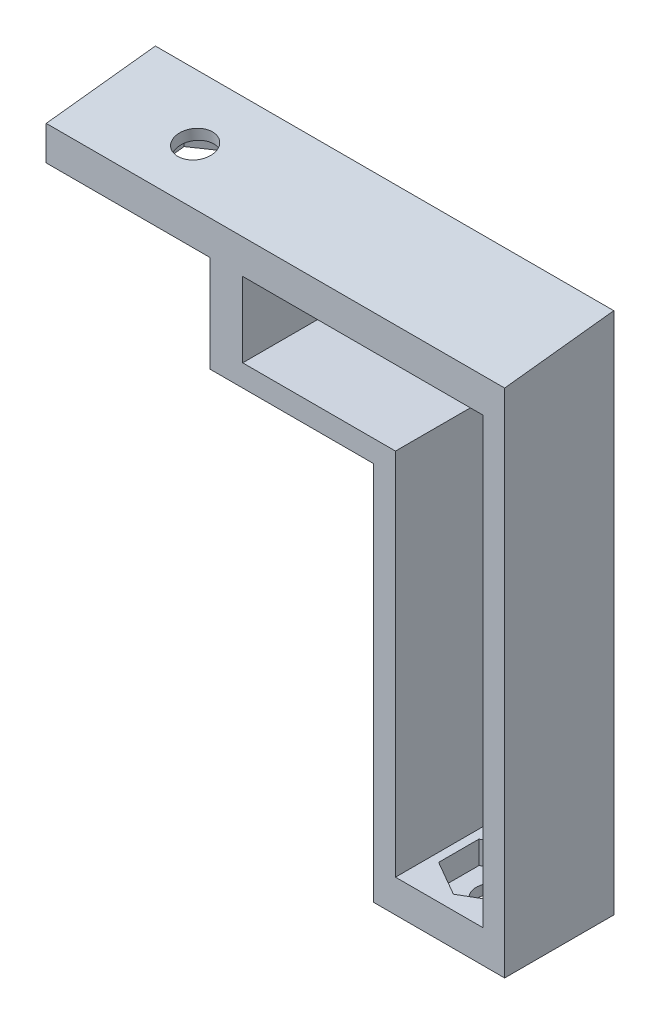
ISO-10303-21;
HEADER;
FILE_DESCRIPTION(('STEP AP214'),'2;1');
FILE_NAME('part.step','',(''),(''),'','','');
FILE_SCHEMA(('AUTOMOTIVE_DESIGN { 1 0 10303 214 1 1 1 1 }'));
ENDSEC;
DATA;
#1=APPLICATION_CONTEXT('core data for automotive mechanical design processes');
#2=APPLICATION_PROTOCOL_DEFINITION('international standard','automotive_design',2000,#1);
#3=PRODUCT_CONTEXT('',#1,'mechanical');
#4=PRODUCT('Part','Part','',(#3));
#5=PRODUCT_RELATED_PRODUCT_CATEGORY('part','',(#4));
#6=PRODUCT_DEFINITION_FORMATION('','',#4);
#7=PRODUCT_DEFINITION_CONTEXT('part definition',#1,'design');
#8=PRODUCT_DEFINITION('design','',#6,#7);
#9=PRODUCT_DEFINITION_SHAPE('','',#8);
#10=(LENGTH_UNIT() NAMED_UNIT(*) SI_UNIT(.MILLI.,.METRE.));
#11=(NAMED_UNIT(*) PLANE_ANGLE_UNIT() SI_UNIT($,.RADIAN.));
#12=(NAMED_UNIT(*) SI_UNIT($,.STERADIAN.) SOLID_ANGLE_UNIT());
#13=UNCERTAINTY_MEASURE_WITH_UNIT(LENGTH_MEASURE(1.E-05),#10,'distance_accuracy_value','');
#14=(GEOMETRIC_REPRESENTATION_CONTEXT(3) GLOBAL_UNCERTAINTY_ASSIGNED_CONTEXT((#13)) GLOBAL_UNIT_ASSIGNED_CONTEXT((#10,
#11,#12)) REPRESENTATION_CONTEXT('',''));
#15=CARTESIAN_POINT('',(0.,0.,0.));
#16=DIRECTION('',(0.,0.,1.));
#17=DIRECTION('',(1.,0.,0.));
#18=AXIS2_PLACEMENT_3D('',#15,#16,#17);
#19=CARTESIAN_POINT('',(45.,0.,-10.));
#20=DIRECTION('',(1.,0.,0.));
#21=DIRECTION('',(0.,-1.,0.));
#22=AXIS2_PLACEMENT_3D('',#19,#20,#21);
#23=PLANE('',#22);
#24=DIRECTION('',(0.,-1.,0.));
#25=VECTOR('',#24,1.);
#26=CARTESIAN_POINT('',(45.,0.,-10.));
#27=LINE('',#26,#25);
#28=CARTESIAN_POINT('',(45.,44.81,-10.));
#29=VERTEX_POINT('',#28);
#30=CARTESIAN_POINT('',(45.,34.81,-10.));
#31=VERTEX_POINT('',#30);
#32=EDGE_CURVE('E360',#29,#31,#27,.T.);
#33=ORIENTED_EDGE('',*,*,#32,.T.);
#34=DIRECTION('',(0.,0.,1.));
#35=VECTOR('',#34,1.);
#36=CARTESIAN_POINT('',(45.,34.81,-10.));
#37=LINE('',#36,#35);
#38=CARTESIAN_POINT('',(45.,34.81,0.));
#39=VERTEX_POINT('',#38);
#40=EDGE_CURVE('E11',#31,#39,#37,.T.);
#41=ORIENTED_EDGE('',*,*,#40,.T.);
#42=DIRECTION('',(0.,-1.,0.));
#43=VECTOR('',#42,1.);
#44=CARTESIAN_POINT('',(45.,0.,0.));
#45=LINE('',#44,#43);
#46=CARTESIAN_POINT('',(45.,43.6706439169836,0.));
#47=VERTEX_POINT('',#46);
#48=EDGE_CURVE('E387',#47,#39,#45,.T.);
#49=ORIENTED_EDGE('',*,*,#48,.F.);
#50=DIRECTION('',(0.,-0.1132032137679,0.993571855676588));
#51=VECTOR('',#50,1.);
#52=CARTESIAN_POINT('',(45.,44.2357613015133,-4.959971627426));
#53=LINE('',#52,#51);
#54=EDGE_CURVE('E338',#29,#47,#53,.T.);
#55=ORIENTED_EDGE('',*,*,#54,.F.);
#56=EDGE_LOOP('',(#33,#41,#49,#55));
#57=FACE_BOUND('',#56,.T.);
#58=ADVANCED_FACE('F39',(#57),#23,.F.);
#59=CARTESIAN_POINT('',(60.,34.81,-10.));
#60=DIRECTION('',(0.,-1.,0.));
#61=DIRECTION('',(-1.,0.,0.));
#62=AXIS2_PLACEMENT_3D('',#59,#60,#61);
#63=PLANE('',#62);
#64=DIRECTION('',(-1.,0.,0.));
#65=VECTOR('',#64,1.);
#66=CARTESIAN_POINT('',(60.,34.81,0.));
#67=LINE('',#66,#65);
#68=CARTESIAN_POINT('',(60.,34.81,0.));
#69=VERTEX_POINT('',#68);
#70=EDGE_CURVE('E345',#69,#39,#67,.T.);
#71=ORIENTED_EDGE('',*,*,#70,.T.);
#72=ORIENTED_EDGE('',*,*,#40,.F.);
#73=DIRECTION('',(-1.,0.,0.));
#74=VECTOR('',#73,1.);
#75=CARTESIAN_POINT('',(60.,34.81,-10.));
#76=LINE('',#75,#74);
#77=CARTESIAN_POINT('',(60.,34.81,-10.));
#78=VERTEX_POINT('',#77);
#79=EDGE_CURVE('E372',#78,#31,#76,.T.);
#80=ORIENTED_EDGE('',*,*,#79,.F.);
#81=DIRECTION('',(0.,0.,1.));
#82=VECTOR('',#81,1.);
#83=CARTESIAN_POINT('',(60.,34.81,-10.));
#84=LINE('',#83,#82);
#85=EDGE_CURVE('E48',#78,#69,#84,.T.);
#86=ORIENTED_EDGE('',*,*,#85,.T.);
#87=EDGE_LOOP('',(#71,#72,#80,#86));
#88=FACE_BOUND('',#87,.T.);
#89=ADVANCED_FACE('F458',(#88),#63,.T.);
#90=CARTESIAN_POINT('',(60.,0.,-10.));
#91=DIRECTION('',(-1.,0.,0.));
#92=DIRECTION('',(0.,0.,-1.));
#93=AXIS2_PLACEMENT_3D('',#90,#91,#92);
#94=PLANE('',#93);
#95=DIRECTION('',(0.,1.,0.));
#96=VECTOR('',#95,1.);
#97=CARTESIAN_POINT('',(60.,0.,0.));
#98=LINE('',#97,#96);
#99=CARTESIAN_POINT('',(60.,0.,0.));
#100=VERTEX_POINT('',#99);
#101=EDGE_CURVE('E399',#100,#69,#98,.T.);
#102=ORIENTED_EDGE('',*,*,#101,.T.);
#103=ORIENTED_EDGE('',*,*,#85,.F.);
#104=DIRECTION('',(0.,1.,0.));
#105=VECTOR('',#104,1.);
#106=CARTESIAN_POINT('',(60.,0.,-10.));
#107=LINE('',#106,#105);
#108=CARTESIAN_POINT('',(60.,0.,-10.));
#109=VERTEX_POINT('',#108);
#110=EDGE_CURVE('E370',#109,#78,#107,.T.);
#111=ORIENTED_EDGE('',*,*,#110,.F.);
#112=DIRECTION('',(0.,0.,1.));
#113=VECTOR('',#112,1.);
#114=CARTESIAN_POINT('',(60.,0.,-10.));
#115=LINE('',#114,#113);
#116=EDGE_CURVE('E404',#109,#100,#115,.T.);
#117=ORIENTED_EDGE('',*,*,#116,.T.);
#118=EDGE_LOOP('',(#102,#103,#111,#117));
#119=FACE_BOUND('',#118,.T.);
#120=ADVANCED_FACE('F463',(#119),#94,.T.);
#121=CARTESIAN_POINT('',(60.,0.,-10.));
#122=DIRECTION('',(0.,-1.,0.));
#123=DIRECTION('',(0.,0.,-1.));
#124=AXIS2_PLACEMENT_3D('',#121,#122,#123);
#125=PLANE('',#124);
#126=CARTESIAN_POINT('',(66.,0.,-5.));
#127=DIRECTION('',(0.,-1.,0.));
#128=DIRECTION('',(0.,0.,1.));
#129=AXIS2_PLACEMENT_3D('',#126,#127,#128);
#130=CIRCLE('',#129,1.6);
#131=CARTESIAN_POINT('',(66.,0.,-3.4));
#132=VERTEX_POINT('',#131);
#133=EDGE_CURVE('E554',#132,#132,#130,.T.);
#134=ORIENTED_EDGE('',*,*,#133,.F.);
#135=EDGE_LOOP('',(#134));
#136=FACE_BOUND('',#135,.T.);
#137=DIRECTION('',(-1.,0.,0.));
#138=VECTOR('',#137,1.);
#139=CARTESIAN_POINT('',(60.,0.,0.));
#140=LINE('',#139,#138);
#141=CARTESIAN_POINT('',(72.,0.,0.));
#142=VERTEX_POINT('',#141);
#143=EDGE_CURVE('E397',#142,#100,#140,.T.);
#144=ORIENTED_EDGE('',*,*,#143,.T.);
#145=ORIENTED_EDGE('',*,*,#116,.F.);
#146=DIRECTION('',(-1.,0.,0.));
#147=VECTOR('',#146,1.);
#148=CARTESIAN_POINT('',(60.,0.,-10.));
#149=LINE('',#148,#147);
#150=CARTESIAN_POINT('',(72.,0.,-10.));
#151=VERTEX_POINT('',#150);
#152=EDGE_CURVE('E368',#151,#109,#149,.T.);
#153=ORIENTED_EDGE('',*,*,#152,.F.);
#154=DIRECTION('',(0.,0.,1.));
#155=VECTOR('',#154,1.);
#156=CARTESIAN_POINT('',(72.,0.,-10.));
#157=LINE('',#156,#155);
#158=EDGE_CURVE('E407',#151,#142,#157,.T.);
#159=ORIENTED_EDGE('',*,*,#158,.T.);
#160=EDGE_LOOP('',(#144,#145,#153,#159));
#161=FACE_BOUND('',#160,.T.);
#162=ADVANCED_FACE('F469',(#136,#161),#125,.T.);
#163=CARTESIAN_POINT('',(72.,0.,-10.));
#164=DIRECTION('',(1.,0.,0.));
#165=DIRECTION('',(0.,-1.,0.));
#166=AXIS2_PLACEMENT_3D('',#163,#164,#165);
#167=PLANE('',#166);
#168=ORIENTED_EDGE('',*,*,#158,.F.);
#169=DIRECTION('',(0.,-1.,0.));
#170=VECTOR('',#169,1.);
#171=CARTESIAN_POINT('',(72.,0.,-10.));
#172=LINE('',#171,#170);
#173=CARTESIAN_POINT('',(72.,47.9493560830164,-10.));
#174=VERTEX_POINT('',#173);
#175=EDGE_CURVE('E366',#174,#151,#172,.T.);
#176=ORIENTED_EDGE('',*,*,#175,.F.);
#177=DIRECTION('',(0.,0.1132032137679,-0.993571855676588));
#178=VECTOR('',#177,1.);
#179=CARTESIAN_POINT('',(72.,46.2101313662985,5.26497942691786));
#180=LINE('',#179,#178);
#181=CARTESIAN_POINT('',(72.,46.81,0.));
#182=VERTEX_POINT('',#181);
#183=EDGE_CURVE('E322',#182,#174,#180,.T.);
#184=ORIENTED_EDGE('',*,*,#183,.F.);
#185=DIRECTION('',(0.,-1.,0.));
#186=VECTOR('',#185,1.);
#187=CARTESIAN_POINT('',(72.,0.,0.));
#188=LINE('',#187,#186);
#189=EDGE_CURVE('E395',#182,#142,#188,.T.);
#190=ORIENTED_EDGE('',*,*,#189,.T.);
#191=EDGE_LOOP('',(#168,#176,#184,#190));
#192=FACE_BOUND('',#191,.T.);
#193=ADVANCED_FACE('F453',(#192),#167,.T.);
#194=CARTESIAN_POINT('',(30.,0.,-10.));
#195=DIRECTION('',(-1.,0.,0.));
#196=DIRECTION('',(0.,0.,-1.));
#197=AXIS2_PLACEMENT_3D('',#194,#195,#196);
#198=PLANE('',#197);
#199=DIRECTION('',(0.,1.,0.));
#200=VECTOR('',#199,1.);
#201=CARTESIAN_POINT('',(30.,0.,0.));
#202=LINE('',#201,#200);
#203=CARTESIAN_POINT('',(30.,43.6706439169836,0.));
#204=VERTEX_POINT('',#203);
#205=CARTESIAN_POINT('',(30.,46.81,0.));
#206=VERTEX_POINT('',#205);
#207=EDGE_CURVE('E390',#204,#206,#202,.T.);
#208=ORIENTED_EDGE('',*,*,#207,.T.);
#209=DIRECTION('',(0.,0.1132032137679,-0.993571855676588));
#210=VECTOR('',#209,1.);
#211=CARTESIAN_POINT('',(30.,46.2101313662985,5.26497942691786));
#212=LINE('',#211,#210);
#213=CARTESIAN_POINT('',(30.,47.9493560830164,-10.));
#214=VERTEX_POINT('',#213);
#215=EDGE_CURVE('E319',#206,#214,#212,.T.);
#216=ORIENTED_EDGE('',*,*,#215,.T.);
#217=DIRECTION('',(0.,1.,0.));
#218=VECTOR('',#217,1.);
#219=CARTESIAN_POINT('',(30.,0.,-10.));
#220=LINE('',#219,#218);
#221=CARTESIAN_POINT('',(30.,44.81,-10.));
#222=VERTEX_POINT('',#221);
#223=EDGE_CURVE('E363',#222,#214,#220,.T.);
#224=ORIENTED_EDGE('',*,*,#223,.F.);
#225=DIRECTION('',(0.,0.1132032137679,-0.993571855676588));
#226=VECTOR('',#225,1.);
#227=CARTESIAN_POINT('',(30.,43.111006029794,4.91187869650019));
#228=LINE('',#227,#226);
#229=EDGE_CURVE('E325',#204,#222,#228,.T.);
#230=ORIENTED_EDGE('',*,*,#229,.F.);
#231=EDGE_LOOP('',(#208,#216,#224,#230));
#232=FACE_BOUND('',#231,.T.);
#233=ADVANCED_FACE('F445',(#232),#198,.T.);
#234=CARTESIAN_POINT('',(70.,0.,-10.));
#235=DIRECTION('',(1.,0.,0.));
#236=DIRECTION('',(0.,-1.,0.));
#237=AXIS2_PLACEMENT_3D('',#234,#235,#236);
#238=PLANE('',#237);
#239=DIRECTION('',(0.,-1.,0.));
#240=VECTOR('',#239,1.);
#241=CARTESIAN_POINT('',(70.,0.,-10.));
#242=LINE('',#241,#240);
#243=CARTESIAN_POINT('',(70.,44.81,-10.));
#244=VERTEX_POINT('',#243);
#245=CARTESIAN_POINT('',(70.,3.,-10.));
#246=VERTEX_POINT('',#245);
#247=EDGE_CURVE('E357',#244,#246,#242,.T.);
#248=ORIENTED_EDGE('',*,*,#247,.T.);
#249=DIRECTION('',(0.,0.,1.));
#250=VECTOR('',#249,1.);
#251=CARTESIAN_POINT('',(70.,3.,-10.));
#252=LINE('',#251,#250);
#253=CARTESIAN_POINT('',(70.,3.,0.));
#254=VERTEX_POINT('',#253);
#255=EDGE_CURVE('E410',#246,#254,#252,.T.);
#256=ORIENTED_EDGE('',*,*,#255,.T.);
#257=DIRECTION('',(0.,-1.,0.));
#258=VECTOR('',#257,1.);
#259=CARTESIAN_POINT('',(70.,0.,0.));
#260=LINE('',#259,#258);
#261=CARTESIAN_POINT('',(70.,43.6706439169836,0.));
#262=VERTEX_POINT('',#261);
#263=EDGE_CURVE('E384',#262,#254,#260,.T.);
#264=ORIENTED_EDGE('',*,*,#263,.F.);
#265=DIRECTION('',(0.,-0.1132032137679,0.993571855676588));
#266=VECTOR('',#265,1.);
#267=CARTESIAN_POINT('',(70.,44.2357613015133,-4.959971627426));
#268=LINE('',#267,#266);
#269=EDGE_CURVE('E335',#244,#262,#268,.T.);
#270=ORIENTED_EDGE('',*,*,#269,.F.);
#271=EDGE_LOOP('',(#248,#256,#264,#270));
#272=FACE_BOUND('',#271,.T.);
#273=ADVANCED_FACE('F443',(#272),#238,.F.);
#274=CARTESIAN_POINT('',(60.,3.,-10.));
#275=DIRECTION('',(0.,-1.,0.));
#276=DIRECTION('',(0.,0.,-1.));
#277=AXIS2_PLACEMENT_3D('',#274,#275,#276);
#278=PLANE('',#277);
#279=DIRECTION('',(0.,0.,-1.));
#280=VECTOR('',#279,1.);
#281=CARTESIAN_POINT('',(62.8,3.,-3.1524791385932));
#282=LINE('',#281,#280);
#283=CARTESIAN_POINT('',(62.8,3.,-3.1524791385932));
#284=VERTEX_POINT('',#283);
#285=CARTESIAN_POINT('',(62.8,3.,-6.8475208614068));
#286=VERTEX_POINT('',#285);
#287=EDGE_CURVE('E231',#284,#286,#282,.T.);
#288=ORIENTED_EDGE('',*,*,#287,.T.);
#289=DIRECTION('',(0.866025403784438,0.,-0.5));
#290=VECTOR('',#289,1.);
#291=CARTESIAN_POINT('',(62.8,3.,-6.8475208614068));
#292=LINE('',#291,#290);
#293=CARTESIAN_POINT('',(66.,3.,-8.6950417228136));
#294=VERTEX_POINT('',#293);
#295=EDGE_CURVE('E255',#286,#294,#292,.T.);
#296=ORIENTED_EDGE('',*,*,#295,.T.);
#297=DIRECTION('',(0.866025403784438,0.,0.5));
#298=VECTOR('',#297,1.);
#299=CARTESIAN_POINT('',(66.,3.,-8.6950417228136));
#300=LINE('',#299,#298);
#301=CARTESIAN_POINT('',(69.2,3.,-6.8475208614068));
#302=VERTEX_POINT('',#301);
#303=EDGE_CURVE('E258',#294,#302,#300,.T.);
#304=ORIENTED_EDGE('',*,*,#303,.T.);
#305=DIRECTION('',(0.,0.,1.));
#306=VECTOR('',#305,1.);
#307=CARTESIAN_POINT('',(69.2,3.,-6.8475208614068));
#308=LINE('',#307,#306);
#309=CARTESIAN_POINT('',(69.2,3.,-3.1524791385932));
#310=VERTEX_POINT('',#309);
#311=EDGE_CURVE('E240',#302,#310,#308,.T.);
#312=ORIENTED_EDGE('',*,*,#311,.T.);
#313=DIRECTION('',(-0.866025403784439,0.,0.5));
#314=VECTOR('',#313,1.);
#315=CARTESIAN_POINT('',(69.2,3.,-3.1524791385932));
#316=LINE('',#315,#314);
#317=CARTESIAN_POINT('',(66.,3.,-1.30495827718639));
#318=VERTEX_POINT('',#317);
#319=EDGE_CURVE('E237',#310,#318,#316,.T.);
#320=ORIENTED_EDGE('',*,*,#319,.T.);
#321=DIRECTION('',(-0.866025403784439,0.,-0.5));
#322=VECTOR('',#321,1.);
#323=CARTESIAN_POINT('',(66.,3.,-1.30495827718639));
#324=LINE('',#323,#322);
#325=EDGE_CURVE('E252',#318,#284,#324,.T.);
#326=ORIENTED_EDGE('',*,*,#325,.T.);
#327=EDGE_LOOP('',(#288,#296,#304,#312,#320,#326));
#328=FACE_BOUND('',#327,.T.);
#329=DIRECTION('',(-1.,0.,0.));
#330=VECTOR('',#329,1.);
#331=CARTESIAN_POINT('',(60.,3.,0.));
#332=LINE('',#331,#330);
#333=CARTESIAN_POINT('',(62.,3.,0.));
#334=VERTEX_POINT('',#333);
#335=EDGE_CURVE('E381',#254,#334,#332,.T.);
#336=ORIENTED_EDGE('',*,*,#335,.F.);
#337=ORIENTED_EDGE('',*,*,#255,.F.);
#338=DIRECTION('',(-1.,0.,0.));
#339=VECTOR('',#338,1.);
#340=CARTESIAN_POINT('',(60.,3.,-10.));
#341=LINE('',#340,#339);
#342=CARTESIAN_POINT('',(62.,3.,-10.));
#343=VERTEX_POINT('',#342);
#344=EDGE_CURVE('E354',#246,#343,#341,.T.);
#345=ORIENTED_EDGE('',*,*,#344,.T.);
#346=DIRECTION('',(0.,0.,1.));
#347=VECTOR('',#346,1.);
#348=CARTESIAN_POINT('',(62.,3.,-10.));
#349=LINE('',#348,#347);
#350=EDGE_CURVE('E413',#343,#334,#349,.T.);
#351=ORIENTED_EDGE('',*,*,#350,.T.);
#352=EDGE_LOOP('',(#336,#337,#345,#351));
#353=FACE_BOUND('',#352,.T.);
#354=ADVANCED_FACE('F431',(#328,#353),#278,.F.);
#355=CARTESIAN_POINT('',(62.,0.,-10.));
#356=DIRECTION('',(-1.,0.,0.));
#357=DIRECTION('',(0.,0.,-1.));
#358=AXIS2_PLACEMENT_3D('',#355,#356,#357);
#359=PLANE('',#358);
#360=DIRECTION('',(0.,1.,0.));
#361=VECTOR('',#360,1.);
#362=CARTESIAN_POINT('',(62.,0.,0.));
#363=LINE('',#362,#361);
#364=CARTESIAN_POINT('',(62.,36.81,0.));
#365=VERTEX_POINT('',#364);
#366=EDGE_CURVE('E378',#334,#365,#363,.T.);
#367=ORIENTED_EDGE('',*,*,#366,.F.);
#368=ORIENTED_EDGE('',*,*,#350,.F.);
#369=DIRECTION('',(0.,1.,0.));
#370=VECTOR('',#369,1.);
#371=CARTESIAN_POINT('',(62.,0.,-10.));
#372=LINE('',#371,#370);
#373=CARTESIAN_POINT('',(62.,36.81,-10.));
#374=VERTEX_POINT('',#373);
#375=EDGE_CURVE('E351',#343,#374,#372,.T.);
#376=ORIENTED_EDGE('',*,*,#375,.T.);
#377=DIRECTION('',(0.,0.,1.));
#378=VECTOR('',#377,1.);
#379=CARTESIAN_POINT('',(62.,36.81,-10.));
#380=LINE('',#379,#378);
#381=EDGE_CURVE('E415',#374,#365,#380,.T.);
#382=ORIENTED_EDGE('',*,*,#381,.T.);
#383=EDGE_LOOP('',(#367,#368,#376,#382));
#384=FACE_BOUND('',#383,.T.);
#385=ADVANCED_FACE('F429',(#384),#359,.F.);
#386=CARTESIAN_POINT('',(60.,36.81,-10.));
#387=DIRECTION('',(0.,-1.,0.));
#388=DIRECTION('',(0.,0.,-1.));
#389=AXIS2_PLACEMENT_3D('',#386,#387,#388);
#390=PLANE('',#389);
#391=DIRECTION('',(-1.,0.,0.));
#392=VECTOR('',#391,1.);
#393=CARTESIAN_POINT('',(60.,36.81,0.));
#394=LINE('',#393,#392);
#395=CARTESIAN_POINT('',(48.,36.81,0.));
#396=VERTEX_POINT('',#395);
#397=EDGE_CURVE('E375',#365,#396,#394,.T.);
#398=ORIENTED_EDGE('',*,*,#397,.F.);
#399=ORIENTED_EDGE('',*,*,#381,.F.);
#400=DIRECTION('',(-1.,0.,0.));
#401=VECTOR('',#400,1.);
#402=CARTESIAN_POINT('',(60.,36.81,-10.));
#403=LINE('',#402,#401);
#404=CARTESIAN_POINT('',(48.,36.81,-10.));
#405=VERTEX_POINT('',#404);
#406=EDGE_CURVE('E348',#374,#405,#403,.T.);
#407=ORIENTED_EDGE('',*,*,#406,.T.);
#408=DIRECTION('',(0.,0.,1.));
#409=VECTOR('',#408,1.);
#410=CARTESIAN_POINT('',(48.,36.81,-10.));
#411=LINE('',#410,#409);
#412=EDGE_CURVE('E43',#405,#396,#411,.T.);
#413=ORIENTED_EDGE('',*,*,#412,.T.);
#414=EDGE_LOOP('',(#398,#399,#407,#413));
#415=FACE_BOUND('',#414,.T.);
#416=ADVANCED_FACE('F422',(#415),#390,.F.);
#417=CARTESIAN_POINT('',(48.,0.,-10.));
#418=DIRECTION('',(1.,0.,0.));
#419=DIRECTION('',(0.,-1.,0.));
#420=AXIS2_PLACEMENT_3D('',#417,#418,#419);
#421=PLANE('',#420);
#422=DIRECTION('',(0.,-0.1132032137679,0.993571855676588));
#423=VECTOR('',#422,1.);
#424=CARTESIAN_POINT('',(48.,44.2357613015133,-4.959971627426));
#425=LINE('',#424,#423);
#426=CARTESIAN_POINT('',(48.,44.81,-10.));
#427=VERTEX_POINT('',#426);
#428=CARTESIAN_POINT('',(48.,43.6706439169836,0.));
#429=VERTEX_POINT('',#428);
#430=EDGE_CURVE('E332',#427,#429,#425,.T.);
#431=ORIENTED_EDGE('',*,*,#430,.T.);
#432=DIRECTION('',(0.,-1.,0.));
#433=VECTOR('',#432,1.);
#434=CARTESIAN_POINT('',(48.,0.,0.));
#435=LINE('',#434,#433);
#436=EDGE_CURVE('E341',#429,#396,#435,.T.);
#437=ORIENTED_EDGE('',*,*,#436,.T.);
#438=ORIENTED_EDGE('',*,*,#412,.F.);
#439=DIRECTION('',(0.,-1.,0.));
#440=VECTOR('',#439,1.);
#441=CARTESIAN_POINT('',(48.,0.,-10.));
#442=LINE('',#441,#440);
#443=EDGE_CURVE('E344',#427,#405,#442,.T.);
#444=ORIENTED_EDGE('',*,*,#443,.F.);
#445=EDGE_LOOP('',(#431,#437,#438,#444));
#446=FACE_BOUND('',#445,.T.);
#447=ADVANCED_FACE('F41',(#446),#421,.T.);
#448=CARTESIAN_POINT('',(60.,0.,-10.));
#449=DIRECTION('',(0.,0.,1.));
#450=DIRECTION('',(-1.,0.,0.));
#451=AXIS2_PLACEMENT_3D('',#448,#449,#450);
#452=PLANE('',#451);
#453=DIRECTION('',(1.,0.,0.));
#454=VECTOR('',#453,1.);
#455=CARTESIAN_POINT('',(60.,44.81,-10.));
#456=LINE('',#455,#454);
#457=EDGE_CURVE('E342',#427,#244,#456,.T.);
#458=ORIENTED_EDGE('',*,*,#457,.F.);
#459=ORIENTED_EDGE('',*,*,#443,.T.);
#460=ORIENTED_EDGE('',*,*,#406,.F.);
#461=ORIENTED_EDGE('',*,*,#375,.F.);
#462=ORIENTED_EDGE('',*,*,#344,.F.);
#463=ORIENTED_EDGE('',*,*,#247,.F.);
#464=EDGE_LOOP('',(#458,#459,#460,#461,#462,#463));
#465=FACE_BOUND('',#464,.T.);
#466=ORIENTED_EDGE('',*,*,#152,.T.);
#467=ORIENTED_EDGE('',*,*,#110,.T.);
#468=ORIENTED_EDGE('',*,*,#79,.T.);
#469=ORIENTED_EDGE('',*,*,#32,.F.);
#470=EDGE_CURVE('E346',#222,#29,#456,.T.);
#471=ORIENTED_EDGE('',*,*,#470,.F.);
#472=ORIENTED_EDGE('',*,*,#223,.T.);
#473=DIRECTION('',(-1.,0.,0.));
#474=VECTOR('',#473,1.);
#475=CARTESIAN_POINT('',(82.0646973269893,47.9493560830164,-10.));
#476=LINE('',#475,#474);
#477=EDGE_CURVE('E309',#174,#214,#476,.T.);
#478=ORIENTED_EDGE('',*,*,#477,.F.);
#479=ORIENTED_EDGE('',*,*,#175,.T.);
#480=EDGE_LOOP('',(#466,#467,#468,#469,#471,#472,#478,#479));
#481=FACE_BOUND('',#480,.T.);
#482=ADVANCED_FACE('F435',(#465,#481),#452,.F.);
#483=CARTESIAN_POINT('',(60.,0.,0.));
#484=DIRECTION('',(0.,0.,1.));
#485=DIRECTION('',(-1.,0.,0.));
#486=AXIS2_PLACEMENT_3D('',#483,#484,#485);
#487=PLANE('',#486);
#488=ORIENTED_EDGE('',*,*,#48,.T.);
#489=ORIENTED_EDGE('',*,*,#70,.F.);
#490=ORIENTED_EDGE('',*,*,#101,.F.);
#491=ORIENTED_EDGE('',*,*,#143,.F.);
#492=ORIENTED_EDGE('',*,*,#189,.F.);
#493=DIRECTION('',(1.,0.,0.));
#494=VECTOR('',#493,1.);
#495=CARTESIAN_POINT('',(60.,46.81,0.));
#496=LINE('',#495,#494);
#497=EDGE_CURVE('E393',#206,#182,#496,.T.);
#498=ORIENTED_EDGE('',*,*,#497,.F.);
#499=ORIENTED_EDGE('',*,*,#207,.F.);
#500=DIRECTION('',(-1.,0.,0.));
#501=VECTOR('',#500,1.);
#502=CARTESIAN_POINT('',(82.0646973269893,43.6706439169836,0.));
#503=LINE('',#502,#501);
#504=EDGE_CURVE('E329',#47,#204,#503,.T.);
#505=ORIENTED_EDGE('',*,*,#504,.F.);
#506=EDGE_LOOP('',(#488,#489,#490,#491,#492,#498,#499,#505));
#507=FACE_BOUND('',#506,.T.);
#508=ORIENTED_EDGE('',*,*,#263,.T.);
#509=ORIENTED_EDGE('',*,*,#335,.T.);
#510=ORIENTED_EDGE('',*,*,#366,.T.);
#511=ORIENTED_EDGE('',*,*,#397,.T.);
#512=ORIENTED_EDGE('',*,*,#436,.F.);
#513=EDGE_CURVE('E331',#262,#429,#503,.T.);
#514=ORIENTED_EDGE('',*,*,#513,.F.);
#515=EDGE_LOOP('',(#508,#509,#510,#511,#512,#514));
#516=FACE_BOUND('',#515,.T.);
#517=ADVANCED_FACE('F427',(#507,#516),#487,.T.);
#518=CARTESIAN_POINT('',(82.0646973269893,43.111006029794,4.91187869650019));
#519=DIRECTION('',(0.,-0.993571855676588,-0.1132032137679));
#520=DIRECTION('',(0.,0.1132032137679,-0.993571855676588));
#521=AXIS2_PLACEMENT_3D('',#518,#519,#520);
#522=PLANE('',#521);
#523=DIRECTION('',(0.,-0.113203213767901,0.993571855676588));
#524=VECTOR('',#523,1.);
#525=CARTESIAN_POINT('',(35.8,44.4494672575063,-6.83564473066917));
#526=LINE('',#525,#524);
#527=CARTESIAN_POINT('',(35.8,44.4494672575063,-6.83564473066917));
#528=VERTEX_POINT('',#527);
#529=CARTESIAN_POINT('',(35.8,44.0311766594773,-3.16435526933084));
#530=VERTEX_POINT('',#529);
#531=EDGE_CURVE('E277',#528,#530,#526,.T.);
#532=ORIENTED_EDGE('',*,*,#531,.T.);
#533=DIRECTION('',(0.866025403784438,-0.0566016068839497,0.496785927838294));
#534=VECTOR('',#533,1.);
#535=CARTESIAN_POINT('',(35.8,44.0311766594773,-3.16435526933083));
#536=LINE('',#535,#534);
#537=CARTESIAN_POINT('',(39.,43.8220313604629,-1.32871053866167));
#538=VERTEX_POINT('',#537);
#539=EDGE_CURVE('E293',#530,#538,#536,.T.);
#540=ORIENTED_EDGE('',*,*,#539,.T.);
#541=DIRECTION('',(0.866025403784439,0.0566016068839496,-0.496785927838294));
#542=VECTOR('',#541,1.);
#543=CARTESIAN_POINT('',(39.,43.8220313604629,-1.32871053866167));
#544=LINE('',#543,#542);
#545=CARTESIAN_POINT('',(42.2,44.0311766594773,-3.16435526933083));
#546=VERTEX_POINT('',#545);
#547=EDGE_CURVE('E296',#538,#546,#544,.T.);
#548=ORIENTED_EDGE('',*,*,#547,.T.);
#549=DIRECTION('',(0.,0.113203213767901,-0.993571855676588));
#550=VECTOR('',#549,1.);
#551=CARTESIAN_POINT('',(42.2,44.0311766594773,-3.16435526933083));
#552=LINE('',#551,#550);
#553=CARTESIAN_POINT('',(42.2,44.4494672575063,-6.83564473066917));
#554=VERTEX_POINT('',#553);
#555=EDGE_CURVE('E299',#546,#554,#552,.T.);
#556=ORIENTED_EDGE('',*,*,#555,.T.);
#557=DIRECTION('',(-0.866025403784439,0.0566016068839495,-0.496785927838294));
#558=VECTOR('',#557,1.);
#559=CARTESIAN_POINT('',(42.2,44.4494672575063,-6.83564473066917));
#560=LINE('',#559,#558);
#561=CARTESIAN_POINT('',(39.,44.6586125565208,-8.67128946133834));
#562=VERTEX_POINT('',#561);
#563=EDGE_CURVE('E302',#554,#562,#560,.T.);
#564=ORIENTED_EDGE('',*,*,#563,.T.);
#565=DIRECTION('',(-0.866025403784439,-0.0566016068839497,0.496785927838294));
#566=VECTOR('',#565,1.);
#567=CARTESIAN_POINT('',(39.,44.6586125565208,-8.67128946133834));
#568=LINE('',#567,#566);
#569=EDGE_CURVE('E281',#562,#528,#568,.T.);
#570=ORIENTED_EDGE('',*,*,#569,.T.);
#571=EDGE_LOOP('',(#532,#540,#548,#556,#564,#570));
#572=FACE_BOUND('',#571,.T.);
#573=ORIENTED_EDGE('',*,*,#54,.T.);
#574=ORIENTED_EDGE('',*,*,#504,.T.);
#575=ORIENTED_EDGE('',*,*,#229,.T.);
#576=ORIENTED_EDGE('',*,*,#470,.T.);
#577=EDGE_LOOP('',(#573,#574,#575,#576));
#578=FACE_BOUND('',#577,.T.);
#579=ADVANCED_FACE('F479',(#572,#578),#522,.T.);
#580=ORIENTED_EDGE('',*,*,#269,.T.);
#581=ORIENTED_EDGE('',*,*,#513,.T.);
#582=ORIENTED_EDGE('',*,*,#430,.F.);
#583=ORIENTED_EDGE('',*,*,#457,.T.);
#584=EDGE_LOOP('',(#580,#581,#582,#583));
#585=FACE_BOUND('',#584,.T.);
#586=ADVANCED_FACE('F439',(#585),#522,.T.);
#587=CARTESIAN_POINT('',(82.0646973269893,46.2101313662985,5.26497942691786));
#588=DIRECTION('',(0.,-0.993571855676588,-0.1132032137679));
#589=DIRECTION('',(0.,0.1132032137679,-0.993571855676588));
#590=AXIS2_PLACEMENT_3D('',#587,#588,#589);
#591=PLANE('',#590);
#592=CARTESIAN_POINT('',(39.,47.3394472949963,-4.64689926958234));
#593=DIRECTION('',(0.,0.993571855676588,0.1132032137679));
#594=DIRECTION('',(0.,0.1132032137679,-0.993571855676588));
#595=AXIS2_PLACEMENT_3D('',#592,#593,#594);
#596=CIRCLE('',#595,1.6);
#597=CARTESIAN_POINT('',(39.,47.520572437025,-6.23661423866488));
#598=VERTEX_POINT('',#597);
#599=EDGE_CURVE('E274',#598,#598,#596,.T.);
#600=ORIENTED_EDGE('',*,*,#599,.F.);
#601=EDGE_LOOP('',(#600));
#602=FACE_BOUND('',#601,.T.);
#603=ORIENTED_EDGE('',*,*,#183,.T.);
#604=ORIENTED_EDGE('',*,*,#477,.T.);
#605=ORIENTED_EDGE('',*,*,#215,.F.);
#606=ORIENTED_EDGE('',*,*,#497,.T.);
#607=EDGE_LOOP('',(#603,#604,#605,#606));
#608=FACE_BOUND('',#607,.T.);
#609=ADVANCED_FACE('F486',(#602,#608),#591,.F.);
#610=CARTESIAN_POINT('',(35.8,46.5359681544272,-6.59791798175658));
#611=DIRECTION('',(-1.,0.,0.));
#612=DIRECTION('',(0.,1.,0.));
#613=AXIS2_PLACEMENT_3D('',#610,#611,#612);
#614=PLANE('',#613);
#615=ORIENTED_EDGE('',*,*,#531,.F.);
#616=DIRECTION('',(0.,-0.993571855676588,-0.1132032137679));
#617=VECTOR('',#616,1.);
#618=CARTESIAN_POINT('',(35.8,46.5359681544272,-6.59791798175658));
#619=LINE('',#618,#617);
#620=CARTESIAN_POINT('',(35.8,46.5359681544272,-6.59791798175658));
#621=VERTEX_POINT('',#620);
#622=EDGE_CURVE('E307',#621,#528,#619,.T.);
#623=ORIENTED_EDGE('',*,*,#622,.F.);
#624=DIRECTION('',(0.,-0.113203213767901,0.993571855676588));
#625=VECTOR('',#624,1.);
#626=CARTESIAN_POINT('',(35.8,46.5359681544272,-6.59791798175658));
#627=LINE('',#626,#625);
#628=CARTESIAN_POINT('',(35.8,46.1176775563982,-2.92662852041824));
#629=VERTEX_POINT('',#628);
#630=EDGE_CURVE('E278',#621,#629,#627,.T.);
#631=ORIENTED_EDGE('',*,*,#630,.T.);
#632=DIRECTION('',(0.,-0.993571855676588,-0.1132032137679));
#633=VECTOR('',#632,1.);
#634=CARTESIAN_POINT('',(35.8,46.1176775563982,-2.92662852041824));
#635=LINE('',#634,#633);
#636=EDGE_CURVE('E64',#629,#530,#635,.T.);
#637=ORIENTED_EDGE('',*,*,#636,.T.);
#638=EDGE_LOOP('',(#615,#623,#631,#637));
#639=FACE_BOUND('',#638,.T.);
#640=ADVANCED_FACE('F489',(#639),#614,.F.);
#641=CARTESIAN_POINT('',(39.,46.7451134534416,-8.43356271242575));
#642=DIRECTION('',(-0.5,0.0980368589130417,-0.860458467501171));
#643=DIRECTION('',(0.864623545564125,0.,-0.502420266764908));
#644=AXIS2_PLACEMENT_3D('',#641,#642,#643);
#645=PLANE('',#644);
#646=ORIENTED_EDGE('',*,*,#569,.F.);
#647=DIRECTION('',(0.,-0.993571855676588,-0.1132032137679));
#648=VECTOR('',#647,1.);
#649=CARTESIAN_POINT('',(39.,46.7451134534416,-8.43356271242575));
#650=LINE('',#649,#648);
#651=CARTESIAN_POINT('',(39.,46.7451134534416,-8.43356271242575));
#652=VERTEX_POINT('',#651);
#653=EDGE_CURVE('E310',#652,#562,#650,.T.);
#654=ORIENTED_EDGE('',*,*,#653,.F.);
#655=DIRECTION('',(-0.866025403784439,-0.0566016068839497,0.496785927838294));
#656=VECTOR('',#655,1.);
#657=CARTESIAN_POINT('',(39.,46.7451134534416,-8.43356271242575));
#658=LINE('',#657,#656);
#659=EDGE_CURVE('E289',#652,#621,#658,.T.);
#660=ORIENTED_EDGE('',*,*,#659,.T.);
#661=ORIENTED_EDGE('',*,*,#622,.T.);
#662=EDGE_LOOP('',(#646,#654,#660,#661));
#663=FACE_BOUND('',#662,.T.);
#664=ADVANCED_FACE('F493',(#663),#645,.F.);
#665=CARTESIAN_POINT('',(42.2,46.5359681544272,-6.59791798175658));
#666=DIRECTION('',(0.5,0.0980368589130418,-0.860458467501171));
#667=DIRECTION('',(0.864623545564125,0.,0.502420266764908));
#668=AXIS2_PLACEMENT_3D('',#665,#666,#667);
#669=PLANE('',#668);
#670=ORIENTED_EDGE('',*,*,#563,.F.);
#671=DIRECTION('',(0.,-0.993571855676588,-0.1132032137679));
#672=VECTOR('',#671,1.);
#673=CARTESIAN_POINT('',(42.2,46.5359681544272,-6.59791798175658));
#674=LINE('',#673,#672);
#675=CARTESIAN_POINT('',(42.2,46.5359681544272,-6.59791798175658));
#676=VERTEX_POINT('',#675);
#677=EDGE_CURVE('E312',#676,#554,#674,.T.);
#678=ORIENTED_EDGE('',*,*,#677,.F.);
#679=DIRECTION('',(-0.866025403784439,0.0566016068839495,-0.496785927838294));
#680=VECTOR('',#679,1.);
#681=CARTESIAN_POINT('',(42.2,46.5359681544272,-6.59791798175658));
#682=LINE('',#681,#680);
#683=EDGE_CURVE('E287',#676,#652,#682,.T.);
#684=ORIENTED_EDGE('',*,*,#683,.T.);
#685=ORIENTED_EDGE('',*,*,#653,.T.);
#686=EDGE_LOOP('',(#670,#678,#684,#685));
#687=FACE_BOUND('',#686,.T.);
#688=ADVANCED_FACE('F506',(#687),#669,.F.);
#689=CARTESIAN_POINT('',(42.2,46.1176775563982,-2.92662852041824));
#690=DIRECTION('',(1.,0.,0.));
#691=DIRECTION('',(0.,-1.,0.));
#692=AXIS2_PLACEMENT_3D('',#689,#690,#691);
#693=PLANE('',#692);
#694=ORIENTED_EDGE('',*,*,#555,.F.);
#695=DIRECTION('',(0.,-0.993571855676588,-0.1132032137679));
#696=VECTOR('',#695,1.);
#697=CARTESIAN_POINT('',(42.2,46.1176775563982,-2.92662852041824));
#698=LINE('',#697,#696);
#699=CARTESIAN_POINT('',(42.2,46.1176775563982,-2.92662852041824));
#700=VERTEX_POINT('',#699);
#701=EDGE_CURVE('E314',#700,#546,#698,.T.);
#702=ORIENTED_EDGE('',*,*,#701,.F.);
#703=DIRECTION('',(0.,0.113203213767901,-0.993571855676588));
#704=VECTOR('',#703,1.);
#705=CARTESIAN_POINT('',(42.2,46.1176775563982,-2.92662852041824));
#706=LINE('',#705,#704);
#707=EDGE_CURVE('E285',#700,#676,#706,.T.);
#708=ORIENTED_EDGE('',*,*,#707,.T.);
#709=ORIENTED_EDGE('',*,*,#677,.T.);
#710=EDGE_LOOP('',(#694,#702,#708,#709));
#711=FACE_BOUND('',#710,.T.);
#712=ADVANCED_FACE('F502',(#711),#693,.F.);
#713=CARTESIAN_POINT('',(39.,45.9085322573837,-1.09098378974908));
#714=DIRECTION('',(0.5,-0.0980368589130417,0.860458467501172));
#715=DIRECTION('',(-0.864623545564125,0.,0.502420266764907));
#716=AXIS2_PLACEMENT_3D('',#713,#714,#715);
#717=PLANE('',#716);
#718=ORIENTED_EDGE('',*,*,#547,.F.);
#719=DIRECTION('',(0.,-0.993571855676588,-0.1132032137679));
#720=VECTOR('',#719,1.);
#721=CARTESIAN_POINT('',(39.,45.9085322573837,-1.09098378974908));
#722=LINE('',#721,#720);
#723=CARTESIAN_POINT('',(39.,45.9085322573837,-1.09098378974908));
#724=VERTEX_POINT('',#723);
#725=EDGE_CURVE('E316',#724,#538,#722,.T.);
#726=ORIENTED_EDGE('',*,*,#725,.F.);
#727=DIRECTION('',(0.866025403784439,0.0566016068839496,-0.496785927838294));
#728=VECTOR('',#727,1.);
#729=CARTESIAN_POINT('',(39.,45.9085322573837,-1.09098378974908));
#730=LINE('',#729,#728);
#731=EDGE_CURVE('E283',#724,#700,#730,.T.);
#732=ORIENTED_EDGE('',*,*,#731,.T.);
#733=ORIENTED_EDGE('',*,*,#701,.T.);
#734=EDGE_LOOP('',(#718,#726,#732,#733));
#735=FACE_BOUND('',#734,.T.);
#736=ADVANCED_FACE('F498',(#735),#717,.F.);
#737=CARTESIAN_POINT('',(35.8,46.1176775563982,-2.92662852041824));
#738=DIRECTION('',(-0.5,-0.0980368589130418,0.860458467501171));
#739=DIRECTION('',(-0.864623545564125,0.,-0.502420266764908));
#740=AXIS2_PLACEMENT_3D('',#737,#738,#739);
#741=PLANE('',#740);
#742=ORIENTED_EDGE('',*,*,#539,.F.);
#743=ORIENTED_EDGE('',*,*,#636,.F.);
#744=DIRECTION('',(0.866025403784438,-0.0566016068839497,0.496785927838294));
#745=VECTOR('',#744,1.);
#746=CARTESIAN_POINT('',(35.8,46.1176775563982,-2.92662852041824));
#747=LINE('',#746,#745);
#748=EDGE_CURVE('E280',#629,#724,#747,.T.);
#749=ORIENTED_EDGE('',*,*,#748,.T.);
#750=ORIENTED_EDGE('',*,*,#725,.T.);
#751=EDGE_LOOP('',(#742,#743,#749,#750));
#752=FACE_BOUND('',#751,.T.);
#753=ADVANCED_FACE('F494',(#752),#741,.F.);
#754=CARTESIAN_POINT('',(60.,45.1975069267149,5.14960544541282));
#755=DIRECTION('',(0.,-0.993571855676588,-0.113203213767901));
#756=DIRECTION('',(0.,0.113203213767901,-0.993571855676588));
#757=AXIS2_PLACEMENT_3D('',#754,#755,#756);
#758=PLANE('',#757);
#759=CARTESIAN_POINT('',(39.,46.3268228554127,-4.76227325108741));
#760=DIRECTION('',(0.,0.993571855676588,0.113203213767901));
#761=DIRECTION('',(0.,0.113203213767901,-0.993571855676588));
#762=AXIS2_PLACEMENT_3D('',#759,#760,#761);
#763=CIRCLE('',#762,1.6);
#764=CARTESIAN_POINT('',(39.,46.5079479974413,-6.35198822016995));
#765=VERTEX_POINT('',#764);
#766=EDGE_CURVE('E264',#765,#765,#763,.T.);
#767=ORIENTED_EDGE('',*,*,#766,.T.);
#768=EDGE_LOOP('',(#767));
#769=FACE_BOUND('',#768,.T.);
#770=ORIENTED_EDGE('',*,*,#630,.F.);
#771=ORIENTED_EDGE('',*,*,#659,.F.);
#772=ORIENTED_EDGE('',*,*,#683,.F.);
#773=ORIENTED_EDGE('',*,*,#707,.F.);
#774=ORIENTED_EDGE('',*,*,#731,.F.);
#775=ORIENTED_EDGE('',*,*,#748,.F.);
#776=EDGE_LOOP('',(#770,#771,#772,#773,#774,#775));
#777=FACE_BOUND('',#776,.T.);
#778=ADVANCED_FACE('F497',(#769,#777),#758,.T.);
#779=CARTESIAN_POINT('',(39.,48.4642025667156,-4.51874959350853));
#780=DIRECTION('',(0.,-0.993571855676588,-0.1132032137679));
#781=DIRECTION('',(0.,0.1132032137679,-0.993571855676588));
#782=AXIS2_PLACEMENT_3D('',#779,#780,#781);
#783=CYLINDRICAL_SURFACE('',#782,1.6);
#784=ORIENTED_EDGE('',*,*,#766,.F.);
#785=EDGE_LOOP('',(#784));
#786=FACE_BOUND('',#785,.T.);
#787=ORIENTED_EDGE('',*,*,#599,.T.);
#788=EDGE_LOOP('',(#787));
#789=FACE_BOUND('',#788,.T.);
#790=ADVANCED_FACE('F516',(#786,#789),#783,.F.);
#791=CARTESIAN_POINT('',(66.,0.9,-1.30495827718639));
#792=DIRECTION('',(-0.5,0.,0.866025403784439));
#793=DIRECTION('',(-0.866025403784439,0.,-0.5));
#794=AXIS2_PLACEMENT_3D('',#791,#792,#793);
#795=PLANE('',#794);
#796=ORIENTED_EDGE('',*,*,#325,.F.);
#797=DIRECTION('',(0.,1.,0.));
#798=VECTOR('',#797,1.);
#799=CARTESIAN_POINT('',(66.,0.9,-1.30495827718639));
#800=LINE('',#799,#798);
#801=CARTESIAN_POINT('',(66.,0.9,-1.30495827718639));
#802=VERTEX_POINT('',#801);
#803=EDGE_CURVE('E236',#802,#318,#800,.T.);
#804=ORIENTED_EDGE('',*,*,#803,.F.);
#805=DIRECTION('',(-0.866025403784439,0.,-0.5));
#806=VECTOR('',#805,1.);
#807=CARTESIAN_POINT('',(66.,0.9,-1.30495827718639));
#808=LINE('',#807,#806);
#809=CARTESIAN_POINT('',(62.8,0.9,-3.1524791385932));
#810=VERTEX_POINT('',#809);
#811=EDGE_CURVE('E221',#802,#810,#808,.T.);
#812=ORIENTED_EDGE('',*,*,#811,.T.);
#813=DIRECTION('',(0.,1.,0.));
#814=VECTOR('',#813,1.);
#815=CARTESIAN_POINT('',(62.8,0.9,-3.1524791385932));
#816=LINE('',#815,#814);
#817=EDGE_CURVE('E56',#810,#284,#816,.T.);
#818=ORIENTED_EDGE('',*,*,#817,.T.);
#819=EDGE_LOOP('',(#796,#804,#812,#818));
#820=FACE_BOUND('',#819,.T.);
#821=ADVANCED_FACE('F235',(#820),#795,.F.);
#822=CARTESIAN_POINT('',(69.2,0.9,-3.1524791385932));
#823=DIRECTION('',(0.5,0.,0.866025403784439));
#824=DIRECTION('',(-0.866025403784439,0.,0.5));
#825=AXIS2_PLACEMENT_3D('',#822,#823,#824);
#826=PLANE('',#825);
#827=ORIENTED_EDGE('',*,*,#319,.F.);
#828=DIRECTION('',(0.,1.,0.));
#829=VECTOR('',#828,1.);
#830=CARTESIAN_POINT('',(69.2,0.9,-3.1524791385932));
#831=LINE('',#830,#829);
#832=CARTESIAN_POINT('',(69.2,0.9,-3.1524791385932));
#833=VERTEX_POINT('',#832);
#834=EDGE_CURVE('E265',#833,#310,#831,.T.);
#835=ORIENTED_EDGE('',*,*,#834,.F.);
#836=DIRECTION('',(-0.866025403784439,0.,0.5));
#837=VECTOR('',#836,1.);
#838=CARTESIAN_POINT('',(69.2,0.9,-3.1524791385932));
#839=LINE('',#838,#837);
#840=EDGE_CURVE('E233',#833,#802,#839,.T.);
#841=ORIENTED_EDGE('',*,*,#840,.T.);
#842=ORIENTED_EDGE('',*,*,#803,.T.);
#843=EDGE_LOOP('',(#827,#835,#841,#842));
#844=FACE_BOUND('',#843,.T.);
#845=ADVANCED_FACE('F523',(#844),#826,.F.);
#846=CARTESIAN_POINT('',(69.2,0.9,-6.8475208614068));
#847=DIRECTION('',(1.,0.,0.));
#848=DIRECTION('',(0.,0.,1.));
#849=AXIS2_PLACEMENT_3D('',#846,#847,#848);
#850=PLANE('',#849);
#851=ORIENTED_EDGE('',*,*,#311,.F.);
#852=DIRECTION('',(0.,1.,0.));
#853=VECTOR('',#852,1.);
#854=CARTESIAN_POINT('',(69.2,0.9,-6.8475208614068));
#855=LINE('',#854,#853);
#856=CARTESIAN_POINT('',(69.2,0.9,-6.8475208614068));
#857=VERTEX_POINT('',#856);
#858=EDGE_CURVE('E267',#857,#302,#855,.T.);
#859=ORIENTED_EDGE('',*,*,#858,.F.);
#860=DIRECTION('',(0.,0.,1.));
#861=VECTOR('',#860,1.);
#862=CARTESIAN_POINT('',(69.2,0.9,-6.8475208614068));
#863=LINE('',#862,#861);
#864=EDGE_CURVE('E249',#857,#833,#863,.T.);
#865=ORIENTED_EDGE('',*,*,#864,.T.);
#866=ORIENTED_EDGE('',*,*,#834,.T.);
#867=EDGE_LOOP('',(#851,#859,#865,#866));
#868=FACE_BOUND('',#867,.T.);
#869=ADVANCED_FACE('F533',(#868),#850,.F.);
#870=CARTESIAN_POINT('',(66.,0.9,-8.6950417228136));
#871=DIRECTION('',(0.5,0.,-0.866025403784438));
#872=DIRECTION('',(0.866025403784439,0.,0.5));
#873=AXIS2_PLACEMENT_3D('',#870,#871,#872);
#874=PLANE('',#873);
#875=ORIENTED_EDGE('',*,*,#303,.F.);
#876=DIRECTION('',(0.,1.,0.));
#877=VECTOR('',#876,1.);
#878=CARTESIAN_POINT('',(66.,0.9,-8.6950417228136));
#879=LINE('',#878,#877);
#880=CARTESIAN_POINT('',(66.,0.9,-8.6950417228136));
#881=VERTEX_POINT('',#880);
#882=EDGE_CURVE('E269',#881,#294,#879,.T.);
#883=ORIENTED_EDGE('',*,*,#882,.F.);
#884=DIRECTION('',(0.866025403784438,0.,0.5));
#885=VECTOR('',#884,1.);
#886=CARTESIAN_POINT('',(66.,0.9,-8.6950417228136));
#887=LINE('',#886,#885);
#888=EDGE_CURVE('E247',#881,#857,#887,.T.);
#889=ORIENTED_EDGE('',*,*,#888,.T.);
#890=ORIENTED_EDGE('',*,*,#858,.T.);
#891=EDGE_LOOP('',(#875,#883,#889,#890));
#892=FACE_BOUND('',#891,.T.);
#893=ADVANCED_FACE('F529',(#892),#874,.F.);
#894=CARTESIAN_POINT('',(62.8,0.9,-6.8475208614068));
#895=DIRECTION('',(-0.5,0.,-0.866025403784438));
#896=DIRECTION('',(0.866025403784439,0.,-0.5));
#897=AXIS2_PLACEMENT_3D('',#894,#895,#896);
#898=PLANE('',#897);
#899=ORIENTED_EDGE('',*,*,#295,.F.);
#900=DIRECTION('',(0.,1.,0.));
#901=VECTOR('',#900,1.);
#902=CARTESIAN_POINT('',(62.8,0.9,-6.8475208614068));
#903=LINE('',#902,#901);
#904=CARTESIAN_POINT('',(62.8,0.9,-6.8475208614068));
#905=VERTEX_POINT('',#904);
#906=EDGE_CURVE('E232',#905,#286,#903,.T.);
#907=ORIENTED_EDGE('',*,*,#906,.F.);
#908=DIRECTION('',(0.866025403784438,0.,-0.5));
#909=VECTOR('',#908,1.);
#910=CARTESIAN_POINT('',(62.8,0.9,-6.8475208614068));
#911=LINE('',#910,#909);
#912=EDGE_CURVE('E224',#905,#881,#911,.T.);
#913=ORIENTED_EDGE('',*,*,#912,.T.);
#914=ORIENTED_EDGE('',*,*,#882,.T.);
#915=EDGE_LOOP('',(#899,#907,#913,#914));
#916=FACE_BOUND('',#915,.T.);
#917=ADVANCED_FACE('F526',(#916),#898,.F.);
#918=CARTESIAN_POINT('',(62.8,0.9,-3.1524791385932));
#919=DIRECTION('',(-1.,0.,0.));
#920=DIRECTION('',(0.,0.,-1.));
#921=AXIS2_PLACEMENT_3D('',#918,#919,#920);
#922=PLANE('',#921);
#923=ORIENTED_EDGE('',*,*,#287,.F.);
#924=ORIENTED_EDGE('',*,*,#817,.F.);
#925=DIRECTION('',(0.,0.,-1.));
#926=VECTOR('',#925,1.);
#927=CARTESIAN_POINT('',(62.8,0.9,-3.1524791385932));
#928=LINE('',#927,#926);
#929=EDGE_CURVE('E218',#810,#905,#928,.T.);
#930=ORIENTED_EDGE('',*,*,#929,.T.);
#931=ORIENTED_EDGE('',*,*,#906,.T.);
#932=EDGE_LOOP('',(#923,#924,#930,#931));
#933=FACE_BOUND('',#932,.T.);
#934=ADVANCED_FACE('F229',(#933),#922,.F.);
#935=CARTESIAN_POINT('',(60.,0.9,0.));
#936=DIRECTION('',(0.,1.,0.));
#937=DIRECTION('',(0.,0.,1.));
#938=AXIS2_PLACEMENT_3D('',#935,#936,#937);
#939=PLANE('',#938);
#940=CARTESIAN_POINT('',(66.,0.9,-5.));
#941=DIRECTION('',(0.,-1.,0.));
#942=DIRECTION('',(0.,0.,1.));
#943=AXIS2_PLACEMENT_3D('',#940,#941,#942);
#944=CIRCLE('',#943,1.6);
#945=CARTESIAN_POINT('',(66.,0.9,-3.4));
#946=VERTEX_POINT('',#945);
#947=EDGE_CURVE('E243',#946,#946,#944,.T.);
#948=ORIENTED_EDGE('',*,*,#947,.T.);
#949=EDGE_LOOP('',(#948));
#950=FACE_BOUND('',#949,.T.);
#951=ORIENTED_EDGE('',*,*,#811,.F.);
#952=ORIENTED_EDGE('',*,*,#840,.F.);
#953=ORIENTED_EDGE('',*,*,#864,.F.);
#954=ORIENTED_EDGE('',*,*,#888,.F.);
#955=ORIENTED_EDGE('',*,*,#912,.F.);
#956=ORIENTED_EDGE('',*,*,#929,.F.);
#957=EDGE_LOOP('',(#951,#952,#953,#954,#955,#956));
#958=FACE_BOUND('',#957,.T.);
#959=ADVANCED_FACE('F219',(#950,#958),#939,.T.);
#960=CARTESIAN_POINT('',(66.,0.,-5.));
#961=DIRECTION('',(0.,1.,0.));
#962=DIRECTION('',(0.,0.,1.));
#963=AXIS2_PLACEMENT_3D('',#960,#961,#962);
#964=CYLINDRICAL_SURFACE('',#963,1.6);
#965=ORIENTED_EDGE('',*,*,#947,.F.);
#966=EDGE_LOOP('',(#965));
#967=FACE_BOUND('',#966,.T.);
#968=ORIENTED_EDGE('',*,*,#133,.T.);
#969=EDGE_LOOP('',(#968));
#970=FACE_BOUND('',#969,.T.);
#971=ADVANCED_FACE('F543',(#967,#970),#964,.F.);
#972=CLOSED_SHELL('',(#58,#89,#120,#162,#193,#233,#273,#354,#385,#416,#447,#482,#517,#579,#586,
#609,#640,#664,#688,#712,#736,#753,#778,#790,#821,#845,#869,#893,#917,#934,#959,#971));
#973=MANIFOLD_SOLID_BREP('B2',#972);
#974=ADVANCED_BREP_SHAPE_REPRESENTATION('',(#18,#973),#14);
#975=SHAPE_DEFINITION_REPRESENTATION(#9,#974);
ENDSEC;
END-ISO-10303-21;
